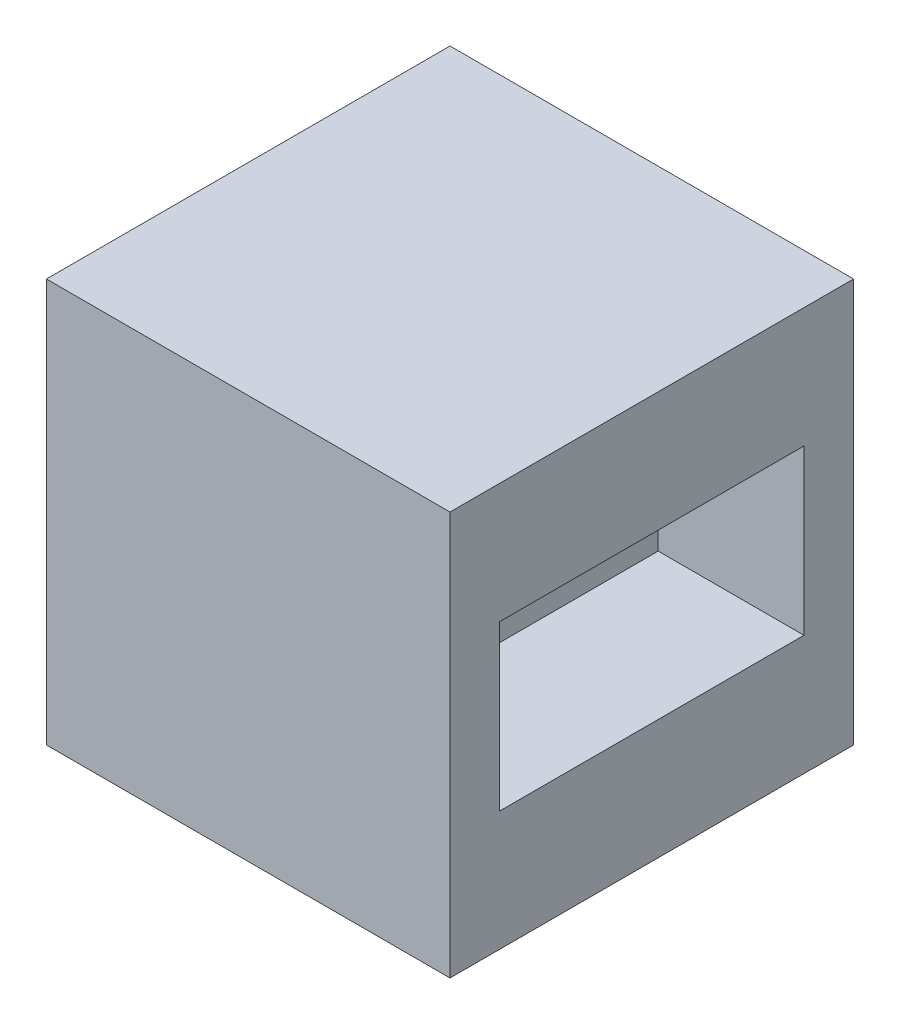
ISO-10303-21;
HEADER;
FILE_DESCRIPTION(('STEP AP214'),'2;1');
FILE_NAME('part.step','',(''),(''),'','','');
FILE_SCHEMA(('AUTOMOTIVE_DESIGN { 1 0 10303 214 1 1 1 1 }'));
ENDSEC;
DATA;
#1=APPLICATION_CONTEXT('core data for automotive mechanical design processes');
#2=APPLICATION_PROTOCOL_DEFINITION('international standard','automotive_design',2000,#1);
#3=PRODUCT_CONTEXT('',#1,'mechanical');
#4=PRODUCT('Part','Part','',(#3));
#5=PRODUCT_RELATED_PRODUCT_CATEGORY('part','',(#4));
#6=PRODUCT_DEFINITION_FORMATION('','',#4);
#7=PRODUCT_DEFINITION_CONTEXT('part definition',#1,'design');
#8=PRODUCT_DEFINITION('design','',#6,#7);
#9=PRODUCT_DEFINITION_SHAPE('','',#8);
#10=(LENGTH_UNIT() NAMED_UNIT(*) SI_UNIT(.MILLI.,.METRE.));
#11=(NAMED_UNIT(*) PLANE_ANGLE_UNIT() SI_UNIT($,.RADIAN.));
#12=(NAMED_UNIT(*) SI_UNIT($,.STERADIAN.) SOLID_ANGLE_UNIT());
#13=UNCERTAINTY_MEASURE_WITH_UNIT(LENGTH_MEASURE(1.E-05),#10,'distance_accuracy_value','');
#14=(GEOMETRIC_REPRESENTATION_CONTEXT(3) GLOBAL_UNCERTAINTY_ASSIGNED_CONTEXT((#13)) GLOBAL_UNIT_ASSIGNED_CONTEXT((#10,
#11,#12)) REPRESENTATION_CONTEXT('',''));
#15=CARTESIAN_POINT('',(0.,0.,0.));
#16=DIRECTION('',(0.,0.,1.));
#17=DIRECTION('',(1.,0.,0.));
#18=AXIS2_PLACEMENT_3D('',#15,#16,#17);
#19=CARTESIAN_POINT('',(0.,0.,30.));
#20=DIRECTION('',(1.,0.,0.));
#21=DIRECTION('',(0.,1.,0.));
#22=AXIS2_PLACEMENT_3D('',#19,#20,#21);
#23=PLANE('',#22);
#24=DIRECTION('',(0.,-1.,0.));
#25=VECTOR('',#24,1.);
#26=CARTESIAN_POINT('',(0.,0.,0.));
#27=LINE('',#26,#25);
#28=CARTESIAN_POINT('',(0.,0.,0.));
#29=VERTEX_POINT('',#28);
#30=CARTESIAN_POINT('',(0.,-30.,0.));
#31=VERTEX_POINT('',#30);
#32=EDGE_CURVE('E183',#29,#31,#27,.T.);
#33=ORIENTED_EDGE('',*,*,#32,.T.);
#34=DIRECTION('',(0.,0.,-1.));
#35=VECTOR('',#34,1.);
#36=CARTESIAN_POINT('',(0.,-30.,30.));
#37=LINE('',#36,#35);
#38=CARTESIAN_POINT('',(0.,-30.,30.));
#39=VERTEX_POINT('',#38);
#40=EDGE_CURVE('E11',#39,#31,#37,.T.);
#41=ORIENTED_EDGE('',*,*,#40,.F.);
#42=DIRECTION('',(0.,-1.,0.));
#43=VECTOR('',#42,1.);
#44=CARTESIAN_POINT('',(0.,0.,30.));
#45=LINE('',#44,#43);
#46=CARTESIAN_POINT('',(0.,0.,30.));
#47=VERTEX_POINT('',#46);
#48=EDGE_CURVE('E189',#47,#39,#45,.T.);
#49=ORIENTED_EDGE('',*,*,#48,.F.);
#50=DIRECTION('',(0.,0.,-1.));
#51=VECTOR('',#50,1.);
#52=CARTESIAN_POINT('',(0.,0.,30.));
#53=LINE('',#52,#51);
#54=EDGE_CURVE('E199',#47,#29,#53,.T.);
#55=ORIENTED_EDGE('',*,*,#54,.T.);
#56=EDGE_LOOP('',(#33,#41,#49,#55));
#57=FACE_BOUND('',#56,.T.);
#58=ADVANCED_FACE('F33',(#57),#23,.F.);
#59=CARTESIAN_POINT('',(0.,-30.,30.));
#60=DIRECTION('',(0.,1.,0.));
#61=DIRECTION('',(0.,0.,1.));
#62=AXIS2_PLACEMENT_3D('',#59,#60,#61);
#63=PLANE('',#62);
#64=DIRECTION('',(1.,0.,0.));
#65=VECTOR('',#64,1.);
#66=CARTESIAN_POINT('',(4.93802979286491,-30.,12.2940973892408));
#67=LINE('',#66,#65);
#68=CARTESIAN_POINT('',(4.93802979286491,-30.,12.2940973892408));
#69=VERTEX_POINT('',#68);
#70=CARTESIAN_POINT('',(24.9380297928649,-30.,12.2940973892408));
#71=VERTEX_POINT('',#70);
#72=EDGE_CURVE('E151',#69,#71,#67,.T.);
#73=ORIENTED_EDGE('',*,*,#72,.F.);
#74=DIRECTION('',(0.,0.,-1.));
#75=VECTOR('',#74,1.);
#76=CARTESIAN_POINT('',(4.93802979286491,-30.,18.2940973892408));
#77=LINE('',#76,#75);
#78=CARTESIAN_POINT('',(4.93802979286491,-30.,18.2940973892408));
#79=VERTEX_POINT('',#78);
#80=EDGE_CURVE('E47',#79,#69,#77,.T.);
#81=ORIENTED_EDGE('',*,*,#80,.F.);
#82=DIRECTION('',(-1.,0.,0.));
#83=VECTOR('',#82,1.);
#84=CARTESIAN_POINT('',(4.93802979286491,-30.,18.2940973892408));
#85=LINE('',#84,#83);
#86=CARTESIAN_POINT('',(24.9380297928649,-30.,18.2940973892408));
#87=VERTEX_POINT('',#86);
#88=EDGE_CURVE('E142',#87,#79,#85,.T.);
#89=ORIENTED_EDGE('',*,*,#88,.F.);
#90=DIRECTION('',(0.,0.,1.));
#91=VECTOR('',#90,1.);
#92=CARTESIAN_POINT('',(24.9380297928649,-30.,18.2940973892408));
#93=LINE('',#92,#91);
#94=EDGE_CURVE('E145',#71,#87,#93,.T.);
#95=ORIENTED_EDGE('',*,*,#94,.F.);
#96=EDGE_LOOP('',(#73,#81,#89,#95));
#97=FACE_BOUND('',#96,.T.);
#98=DIRECTION('',(1.,0.,0.));
#99=VECTOR('',#98,1.);
#100=CARTESIAN_POINT('',(0.,-30.,0.));
#101=LINE('',#100,#99);
#102=CARTESIAN_POINT('',(30.,-30.,0.));
#103=VERTEX_POINT('',#102);
#104=EDGE_CURVE('E202',#31,#103,#101,.T.);
#105=ORIENTED_EDGE('',*,*,#104,.T.);
#106=DIRECTION('',(0.,0.,-1.));
#107=VECTOR('',#106,1.);
#108=CARTESIAN_POINT('',(30.,-30.,30.));
#109=LINE('',#108,#107);
#110=CARTESIAN_POINT('',(30.,-30.,30.));
#111=VERTEX_POINT('',#110);
#112=EDGE_CURVE('E40',#111,#103,#109,.T.);
#113=ORIENTED_EDGE('',*,*,#112,.F.);
#114=DIRECTION('',(1.,0.,0.));
#115=VECTOR('',#114,1.);
#116=CARTESIAN_POINT('',(0.,-30.,30.));
#117=LINE('',#116,#115);
#118=EDGE_CURVE('E192',#39,#111,#117,.T.);
#119=ORIENTED_EDGE('',*,*,#118,.F.);
#120=ORIENTED_EDGE('',*,*,#40,.T.);
#121=EDGE_LOOP('',(#105,#113,#119,#120));
#122=FACE_BOUND('',#121,.T.);
#123=ADVANCED_FACE('F232',(#97,#122),#63,.F.);
#124=CARTESIAN_POINT('',(30.,0.,30.));
#125=DIRECTION('',(-1.,0.,0.));
#126=DIRECTION('',(0.,0.,1.));
#127=AXIS2_PLACEMENT_3D('',#124,#125,#126);
#128=PLANE('',#127);
#129=DIRECTION('',(0.,-1.,0.));
#130=VECTOR('',#129,1.);
#131=CARTESIAN_POINT('',(30.,0.,3.685));
#132=LINE('',#131,#130);
#133=CARTESIAN_POINT('',(30.,-8.90500000000001,3.685));
#134=VERTEX_POINT('',#133);
#135=CARTESIAN_POINT('',(30.,-21.095,3.685));
#136=VERTEX_POINT('',#135);
#137=EDGE_CURVE('E173',#134,#136,#132,.T.);
#138=ORIENTED_EDGE('',*,*,#137,.T.);
#139=DIRECTION('',(0.,0.,-1.));
#140=VECTOR('',#139,1.);
#141=CARTESIAN_POINT('',(30.,-21.095,0.));
#142=LINE('',#141,#140);
#143=CARTESIAN_POINT('',(30.,-21.095,26.315));
#144=VERTEX_POINT('',#143);
#145=EDGE_CURVE('E55',#144,#136,#142,.T.);
#146=ORIENTED_EDGE('',*,*,#145,.F.);
#147=DIRECTION('',(0.,-1.,0.));
#148=VECTOR('',#147,1.);
#149=CARTESIAN_POINT('',(30.,0.,26.315));
#150=LINE('',#149,#148);
#151=CARTESIAN_POINT('',(30.,-8.90500000000002,26.315));
#152=VERTEX_POINT('',#151);
#153=EDGE_CURVE('E164',#152,#144,#150,.T.);
#154=ORIENTED_EDGE('',*,*,#153,.F.);
#155=DIRECTION('',(0.,0.,-1.));
#156=VECTOR('',#155,1.);
#157=CARTESIAN_POINT('',(30.,-8.905,0.));
#158=LINE('',#157,#156);
#159=EDGE_CURVE('E176',#152,#134,#158,.T.);
#160=ORIENTED_EDGE('',*,*,#159,.T.);
#161=EDGE_LOOP('',(#138,#146,#154,#160));
#162=FACE_BOUND('',#161,.T.);
#163=DIRECTION('',(0.,1.,0.));
#164=VECTOR('',#163,1.);
#165=CARTESIAN_POINT('',(30.,0.,0.));
#166=LINE('',#165,#164);
#167=CARTESIAN_POINT('',(30.,0.,0.));
#168=VERTEX_POINT('',#167);
#169=EDGE_CURVE('E204',#103,#168,#166,.T.);
#170=ORIENTED_EDGE('',*,*,#169,.T.);
#171=DIRECTION('',(0.,0.,-1.));
#172=VECTOR('',#171,1.);
#173=CARTESIAN_POINT('',(30.,0.,30.));
#174=LINE('',#173,#172);
#175=CARTESIAN_POINT('',(30.,0.,30.));
#176=VERTEX_POINT('',#175);
#177=EDGE_CURVE('E209',#176,#168,#174,.T.);
#178=ORIENTED_EDGE('',*,*,#177,.F.);
#179=DIRECTION('',(0.,1.,0.));
#180=VECTOR('',#179,1.);
#181=CARTESIAN_POINT('',(30.,0.,30.));
#182=LINE('',#181,#180);
#183=EDGE_CURVE('E195',#111,#176,#182,.T.);
#184=ORIENTED_EDGE('',*,*,#183,.F.);
#185=ORIENTED_EDGE('',*,*,#112,.T.);
#186=EDGE_LOOP('',(#170,#178,#184,#185));
#187=FACE_BOUND('',#186,.T.);
#188=ADVANCED_FACE('F216',(#162,#187),#128,.F.);
#189=CARTESIAN_POINT('',(0.,0.,30.));
#190=DIRECTION('',(0.,-1.,0.));
#191=DIRECTION('',(0.,0.,-1.));
#192=AXIS2_PLACEMENT_3D('',#189,#190,#191);
#193=PLANE('',#192);
#194=DIRECTION('',(-1.,0.,0.));
#195=VECTOR('',#194,1.);
#196=CARTESIAN_POINT('',(0.,0.,0.));
#197=LINE('',#196,#195);
#198=EDGE_CURVE('E193',#168,#29,#197,.T.);
#199=ORIENTED_EDGE('',*,*,#198,.T.);
#200=ORIENTED_EDGE('',*,*,#54,.F.);
#201=DIRECTION('',(-1.,0.,0.));
#202=VECTOR('',#201,1.);
#203=CARTESIAN_POINT('',(0.,0.,30.));
#204=LINE('',#203,#202);
#205=EDGE_CURVE('E197',#176,#47,#204,.T.);
#206=ORIENTED_EDGE('',*,*,#205,.F.);
#207=ORIENTED_EDGE('',*,*,#177,.T.);
#208=EDGE_LOOP('',(#199,#200,#206,#207));
#209=FACE_BOUND('',#208,.T.);
#210=ADVANCED_FACE('F225',(#209),#193,.F.);
#211=CARTESIAN_POINT('',(0.,0.,30.));
#212=DIRECTION('',(0.,0.,1.));
#213=DIRECTION('',(1.,0.,0.));
#214=AXIS2_PLACEMENT_3D('',#211,#212,#213);
#215=PLANE('',#214);
#216=ORIENTED_EDGE('',*,*,#48,.T.);
#217=ORIENTED_EDGE('',*,*,#118,.T.);
#218=ORIENTED_EDGE('',*,*,#183,.T.);
#219=ORIENTED_EDGE('',*,*,#205,.T.);
#220=EDGE_LOOP('',(#216,#217,#218,#219));
#221=FACE_BOUND('',#220,.T.);
#222=ADVANCED_FACE('F231',(#221),#215,.T.);
#223=CARTESIAN_POINT('',(0.,0.,0.));
#224=DIRECTION('',(0.,0.,1.));
#225=DIRECTION('',(1.,0.,0.));
#226=AXIS2_PLACEMENT_3D('',#223,#224,#225);
#227=PLANE('',#226);
#228=ORIENTED_EDGE('',*,*,#32,.F.);
#229=ORIENTED_EDGE('',*,*,#198,.F.);
#230=ORIENTED_EDGE('',*,*,#169,.F.);
#231=ORIENTED_EDGE('',*,*,#104,.F.);
#232=EDGE_LOOP('',(#228,#229,#230,#231));
#233=FACE_BOUND('',#232,.T.);
#234=ADVANCED_FACE('F222',(#233),#227,.F.);
#235=CARTESIAN_POINT('',(19.16,-21.095,0.));
#236=DIRECTION('',(0.,-1.,0.));
#237=DIRECTION('',(0.,0.,-1.));
#238=AXIS2_PLACEMENT_3D('',#235,#236,#237);
#239=PLANE('',#238);
#240=ORIENTED_EDGE('',*,*,#145,.T.);
#241=DIRECTION('',(1.,0.,0.));
#242=VECTOR('',#241,1.);
#243=CARTESIAN_POINT('',(19.16,-21.095,3.685));
#244=LINE('',#243,#242);
#245=CARTESIAN_POINT('',(19.16,-21.095,3.685));
#246=VERTEX_POINT('',#245);
#247=EDGE_CURVE('E171',#246,#136,#244,.T.);
#248=ORIENTED_EDGE('',*,*,#247,.F.);
#249=DIRECTION('',(0.,0.,-1.));
#250=VECTOR('',#249,1.);
#251=CARTESIAN_POINT('',(19.16,-21.095,0.));
#252=LINE('',#251,#250);
#253=CARTESIAN_POINT('',(19.16,-21.095,26.315));
#254=VERTEX_POINT('',#253);
#255=EDGE_CURVE('E160',#254,#246,#252,.T.);
#256=ORIENTED_EDGE('',*,*,#255,.F.);
#257=DIRECTION('',(1.,0.,0.));
#258=VECTOR('',#257,1.);
#259=CARTESIAN_POINT('',(19.16,-21.095,26.315));
#260=LINE('',#259,#258);
#261=EDGE_CURVE('E181',#254,#144,#260,.T.);
#262=ORIENTED_EDGE('',*,*,#261,.T.);
#263=EDGE_LOOP('',(#240,#248,#256,#262));
#264=FACE_BOUND('',#263,.T.);
#265=ADVANCED_FACE('F246',(#264),#239,.F.);
#266=CARTESIAN_POINT('',(19.16,0.,26.315));
#267=DIRECTION('',(0.,0.,1.));
#268=DIRECTION('',(1.,0.,0.));
#269=AXIS2_PLACEMENT_3D('',#266,#267,#268);
#270=PLANE('',#269);
#271=ORIENTED_EDGE('',*,*,#153,.T.);
#272=ORIENTED_EDGE('',*,*,#261,.F.);
#273=DIRECTION('',(0.,-1.,0.));
#274=VECTOR('',#273,1.);
#275=CARTESIAN_POINT('',(19.16,0.,26.315));
#276=LINE('',#275,#274);
#277=CARTESIAN_POINT('',(19.16,-8.90500000000002,26.315));
#278=VERTEX_POINT('',#277);
#279=EDGE_CURVE('E168',#278,#254,#276,.T.);
#280=ORIENTED_EDGE('',*,*,#279,.F.);
#281=DIRECTION('',(1.,0.,0.));
#282=VECTOR('',#281,1.);
#283=CARTESIAN_POINT('',(19.16,-8.90500000000002,26.315));
#284=LINE('',#283,#282);
#285=EDGE_CURVE('E184',#278,#152,#284,.T.);
#286=ORIENTED_EDGE('',*,*,#285,.T.);
#287=EDGE_LOOP('',(#271,#272,#280,#286));
#288=FACE_BOUND('',#287,.T.);
#289=ADVANCED_FACE('F251',(#288),#270,.F.);
#290=CARTESIAN_POINT('',(19.16,-8.905,0.));
#291=DIRECTION('',(0.,-1.,0.));
#292=DIRECTION('',(0.,0.,-1.));
#293=AXIS2_PLACEMENT_3D('',#290,#291,#292);
#294=PLANE('',#293);
#295=ORIENTED_EDGE('',*,*,#159,.F.);
#296=ORIENTED_EDGE('',*,*,#285,.F.);
#297=DIRECTION('',(0.,0.,-1.));
#298=VECTOR('',#297,1.);
#299=CARTESIAN_POINT('',(19.16,-8.905,0.));
#300=LINE('',#299,#298);
#301=CARTESIAN_POINT('',(19.16,-8.90500000000001,3.685));
#302=VERTEX_POINT('',#301);
#303=EDGE_CURVE('E166',#278,#302,#300,.T.);
#304=ORIENTED_EDGE('',*,*,#303,.T.);
#305=DIRECTION('',(1.,0.,0.));
#306=VECTOR('',#305,1.);
#307=CARTESIAN_POINT('',(19.16,-8.90500000000001,3.685));
#308=LINE('',#307,#306);
#309=EDGE_CURVE('E186',#302,#134,#308,.T.);
#310=ORIENTED_EDGE('',*,*,#309,.T.);
#311=EDGE_LOOP('',(#295,#296,#304,#310));
#312=FACE_BOUND('',#311,.T.);
#313=ADVANCED_FACE('F256',(#312),#294,.T.);
#314=CARTESIAN_POINT('',(19.16,0.,3.685));
#315=DIRECTION('',(0.,0.,1.));
#316=DIRECTION('',(1.,0.,0.));
#317=AXIS2_PLACEMENT_3D('',#314,#315,#316);
#318=PLANE('',#317);
#319=ORIENTED_EDGE('',*,*,#137,.F.);
#320=ORIENTED_EDGE('',*,*,#309,.F.);
#321=DIRECTION('',(0.,-1.,0.));
#322=VECTOR('',#321,1.);
#323=CARTESIAN_POINT('',(19.16,0.,3.685));
#324=LINE('',#323,#322);
#325=EDGE_CURVE('E163',#302,#246,#324,.T.);
#326=ORIENTED_EDGE('',*,*,#325,.T.);
#327=ORIENTED_EDGE('',*,*,#247,.T.);
#328=EDGE_LOOP('',(#319,#320,#326,#327));
#329=FACE_BOUND('',#328,.T.);
#330=ADVANCED_FACE('F252',(#329),#318,.T.);
#331=CARTESIAN_POINT('',(19.16,0.,0.));
#332=DIRECTION('',(1.,0.,0.));
#333=DIRECTION('',(0.,0.,-1.));
#334=AXIS2_PLACEMENT_3D('',#331,#332,#333);
#335=PLANE('',#334);
#336=ORIENTED_EDGE('',*,*,#255,.T.);
#337=ORIENTED_EDGE('',*,*,#325,.F.);
#338=ORIENTED_EDGE('',*,*,#303,.F.);
#339=ORIENTED_EDGE('',*,*,#279,.T.);
#340=EDGE_LOOP('',(#336,#337,#338,#339));
#341=FACE_BOUND('',#340,.T.);
#342=ADVANCED_FACE('F255',(#341),#335,.T.);
#343=CARTESIAN_POINT('',(4.93802979286491,-28.,18.2940973892408));
#344=DIRECTION('',(-1.,0.,0.));
#345=DIRECTION('',(0.,0.,1.));
#346=AXIS2_PLACEMENT_3D('',#343,#344,#345);
#347=PLANE('',#346);
#348=ORIENTED_EDGE('',*,*,#80,.T.);
#349=DIRECTION('',(0.,-1.,0.));
#350=VECTOR('',#349,1.);
#351=CARTESIAN_POINT('',(4.93802979286491,-28.,12.2940973892408));
#352=LINE('',#351,#350);
#353=CARTESIAN_POINT('',(4.93802979286491,-28.,12.2940973892408));
#354=VERTEX_POINT('',#353);
#355=EDGE_CURVE('E120',#354,#69,#352,.T.);
#356=ORIENTED_EDGE('',*,*,#355,.F.);
#357=DIRECTION('',(0.,0.,-1.));
#358=VECTOR('',#357,1.);
#359=CARTESIAN_POINT('',(4.93802979286491,-28.,18.2940973892408));
#360=LINE('',#359,#358);
#361=CARTESIAN_POINT('',(4.93802979286491,-28.,18.2940973892408));
#362=VERTEX_POINT('',#361);
#363=EDGE_CURVE('E124',#362,#354,#360,.T.);
#364=ORIENTED_EDGE('',*,*,#363,.F.);
#365=DIRECTION('',(0.,-1.,0.));
#366=VECTOR('',#365,1.);
#367=CARTESIAN_POINT('',(4.93802979286491,-28.,18.2940973892408));
#368=LINE('',#367,#366);
#369=EDGE_CURVE('E155',#362,#79,#368,.T.);
#370=ORIENTED_EDGE('',*,*,#369,.T.);
#371=EDGE_LOOP('',(#348,#356,#364,#370));
#372=FACE_BOUND('',#371,.T.);
#373=ADVANCED_FACE('F122',(#372),#347,.F.);
#374=CARTESIAN_POINT('',(4.93802979286491,-28.,18.2940973892408));
#375=DIRECTION('',(0.,0.,1.));
#376=DIRECTION('',(1.,0.,0.));
#377=AXIS2_PLACEMENT_3D('',#374,#375,#376);
#378=PLANE('',#377);
#379=ORIENTED_EDGE('',*,*,#88,.T.);
#380=ORIENTED_EDGE('',*,*,#369,.F.);
#381=DIRECTION('',(-1.,0.,0.));
#382=VECTOR('',#381,1.);
#383=CARTESIAN_POINT('',(4.93802979286491,-28.,18.2940973892408));
#384=LINE('',#383,#382);
#385=CARTESIAN_POINT('',(24.9380297928649,-28.,18.2940973892408));
#386=VERTEX_POINT('',#385);
#387=EDGE_CURVE('E130',#386,#362,#384,.T.);
#388=ORIENTED_EDGE('',*,*,#387,.F.);
#389=DIRECTION('',(0.,-1.,0.));
#390=VECTOR('',#389,1.);
#391=CARTESIAN_POINT('',(24.9380297928649,-28.,18.2940973892408));
#392=LINE('',#391,#390);
#393=EDGE_CURVE('E157',#386,#87,#392,.T.);
#394=ORIENTED_EDGE('',*,*,#393,.T.);
#395=EDGE_LOOP('',(#379,#380,#388,#394));
#396=FACE_BOUND('',#395,.T.);
#397=ADVANCED_FACE('F269',(#396),#378,.F.);
#398=CARTESIAN_POINT('',(24.9380297928649,-28.,18.2940973892408));
#399=DIRECTION('',(1.,0.,0.));
#400=DIRECTION('',(0.,0.,-1.));
#401=AXIS2_PLACEMENT_3D('',#398,#399,#400);
#402=PLANE('',#401);
#403=ORIENTED_EDGE('',*,*,#94,.T.);
#404=ORIENTED_EDGE('',*,*,#393,.F.);
#405=DIRECTION('',(0.,0.,1.));
#406=VECTOR('',#405,1.);
#407=CARTESIAN_POINT('',(24.9380297928649,-28.,18.2940973892408));
#408=LINE('',#407,#406);
#409=CARTESIAN_POINT('',(24.9380297928649,-28.,12.2940973892408));
#410=VERTEX_POINT('',#409);
#411=EDGE_CURVE('E138',#410,#386,#408,.T.);
#412=ORIENTED_EDGE('',*,*,#411,.F.);
#413=DIRECTION('',(0.,-1.,0.));
#414=VECTOR('',#413,1.);
#415=CARTESIAN_POINT('',(24.9380297928649,-28.,12.2940973892408));
#416=LINE('',#415,#414);
#417=EDGE_CURVE('E129',#410,#71,#416,.T.);
#418=ORIENTED_EDGE('',*,*,#417,.T.);
#419=EDGE_LOOP('',(#403,#404,#412,#418));
#420=FACE_BOUND('',#419,.T.);
#421=ADVANCED_FACE('F272',(#420),#402,.F.);
#422=CARTESIAN_POINT('',(4.93802979286491,-28.,12.2940973892408));
#423=DIRECTION('',(0.,0.,-1.));
#424=DIRECTION('',(-1.,0.,0.));
#425=AXIS2_PLACEMENT_3D('',#422,#423,#424);
#426=PLANE('',#425);
#427=ORIENTED_EDGE('',*,*,#72,.T.);
#428=ORIENTED_EDGE('',*,*,#417,.F.);
#429=DIRECTION('',(1.,0.,0.));
#430=VECTOR('',#429,1.);
#431=CARTESIAN_POINT('',(4.93802979286491,-28.,12.2940973892408));
#432=LINE('',#431,#430);
#433=EDGE_CURVE('E133',#354,#410,#432,.T.);
#434=ORIENTED_EDGE('',*,*,#433,.F.);
#435=ORIENTED_EDGE('',*,*,#355,.T.);
#436=EDGE_LOOP('',(#427,#428,#434,#435));
#437=FACE_BOUND('',#436,.T.);
#438=ADVANCED_FACE('F134',(#437),#426,.F.);
#439=CARTESIAN_POINT('',(0.,-28.,0.));
#440=DIRECTION('',(0.,-1.,0.));
#441=DIRECTION('',(0.,0.,-1.));
#442=AXIS2_PLACEMENT_3D('',#439,#440,#441);
#443=PLANE('',#442);
#444=ORIENTED_EDGE('',*,*,#363,.T.);
#445=ORIENTED_EDGE('',*,*,#433,.T.);
#446=ORIENTED_EDGE('',*,*,#411,.T.);
#447=ORIENTED_EDGE('',*,*,#387,.T.);
#448=EDGE_LOOP('',(#444,#445,#446,#447));
#449=FACE_BOUND('',#448,.T.);
#450=ADVANCED_FACE('F140',(#449),#443,.T.);
#451=CLOSED_SHELL('',(#58,#123,#188,#210,#222,#234,#265,#289,#313,#330,#342,#373,#397,#421,#438,#450));
#452=MANIFOLD_SOLID_BREP('B2',#451);
#453=ADVANCED_BREP_SHAPE_REPRESENTATION('',(#18,#452),#14);
#454=SHAPE_DEFINITION_REPRESENTATION(#9,#453);
ENDSEC;
END-ISO-10303-21;
